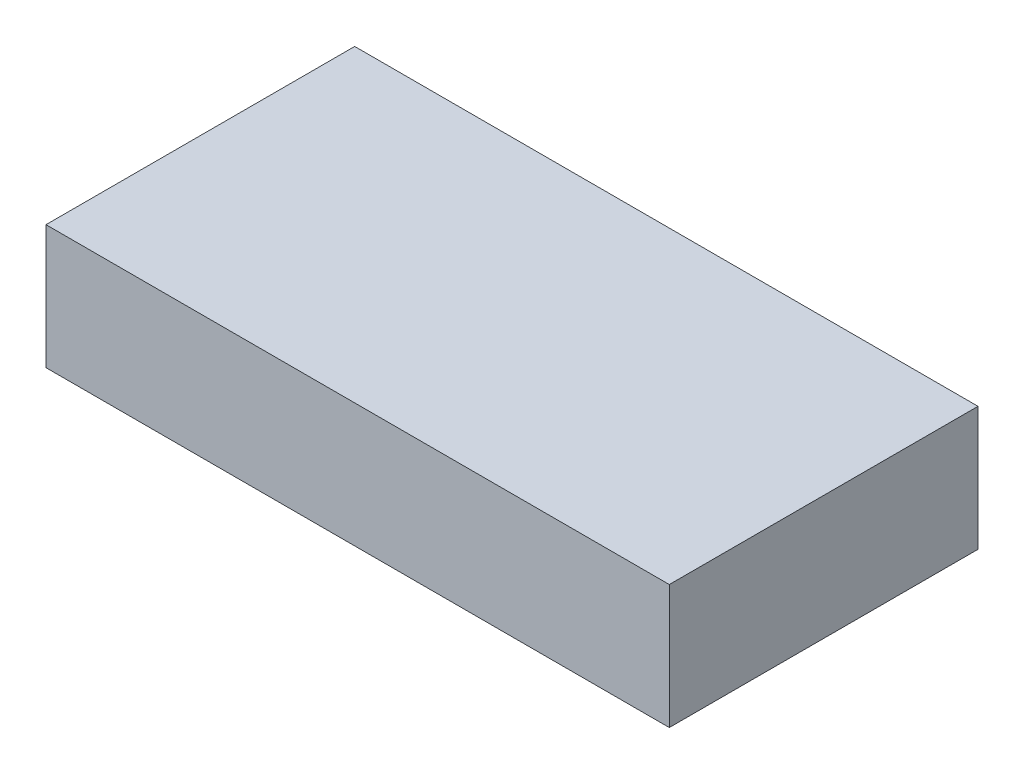
ISO-10303-21;
HEADER;
FILE_DESCRIPTION(('STEP AP214'),'2;1');
FILE_NAME('part.step','',(''),(''),'','','');
FILE_SCHEMA(('AUTOMOTIVE_DESIGN { 1 0 10303 214 1 1 1 1 }'));
ENDSEC;
DATA;
#1=APPLICATION_CONTEXT('core data for automotive mechanical design processes');
#2=APPLICATION_PROTOCOL_DEFINITION('international standard','automotive_design',2000,#1);
#3=PRODUCT_CONTEXT('',#1,'mechanical');
#4=PRODUCT('Part','Part','',(#3));
#5=PRODUCT_RELATED_PRODUCT_CATEGORY('part','',(#4));
#6=PRODUCT_DEFINITION_FORMATION('','',#4);
#7=PRODUCT_DEFINITION_CONTEXT('part definition',#1,'design');
#8=PRODUCT_DEFINITION('design','',#6,#7);
#9=PRODUCT_DEFINITION_SHAPE('','',#8);
#10=(LENGTH_UNIT() NAMED_UNIT(*) SI_UNIT(.MILLI.,.METRE.));
#11=(NAMED_UNIT(*) PLANE_ANGLE_UNIT() SI_UNIT($,.RADIAN.));
#12=(NAMED_UNIT(*) SI_UNIT($,.STERADIAN.) SOLID_ANGLE_UNIT());
#13=UNCERTAINTY_MEASURE_WITH_UNIT(LENGTH_MEASURE(1.E-05),#10,'distance_accuracy_value','');
#14=(GEOMETRIC_REPRESENTATION_CONTEXT(3) GLOBAL_UNCERTAINTY_ASSIGNED_CONTEXT((#13)) GLOBAL_UNIT_ASSIGNED_CONTEXT((#10,
#11,#12)) REPRESENTATION_CONTEXT('',''));
#15=CARTESIAN_POINT('',(0.,0.,0.));
#16=DIRECTION('',(0.,0.,1.));
#17=DIRECTION('',(1.,0.,0.));
#18=AXIS2_PLACEMENT_3D('',#15,#16,#17);
#19=CARTESIAN_POINT('',(7.925,-3.15,-3.925));
#20=DIRECTION('',(1.,0.,0.));
#21=DIRECTION('',(0.,0.,-1.));
#22=AXIS2_PLACEMENT_3D('',#19,#20,#21);
#23=PLANE('',#22);
#24=DIRECTION('',(0.,0.,-1.));
#25=VECTOR('',#24,1.);
#26=CARTESIAN_POINT('',(7.925,0.,-3.925));
#27=LINE('',#26,#25);
#28=CARTESIAN_POINT('',(7.925,0.,3.925));
#29=VERTEX_POINT('',#28);
#30=CARTESIAN_POINT('',(7.925,0.,-3.925));
#31=VERTEX_POINT('',#30);
#32=EDGE_CURVE('E115',#29,#31,#27,.T.);
#33=ORIENTED_EDGE('',*,*,#32,.F.);
#34=DIRECTION('',(0.,1.,0.));
#35=VECTOR('',#34,1.);
#36=CARTESIAN_POINT('',(7.925,-3.15,3.925));
#37=LINE('',#36,#35);
#38=CARTESIAN_POINT('',(7.925,-3.15,3.925));
#39=VERTEX_POINT('',#38);
#40=EDGE_CURVE('E11',#39,#29,#37,.T.);
#41=ORIENTED_EDGE('',*,*,#40,.F.);
#42=DIRECTION('',(0.,0.,-1.));
#43=VECTOR('',#42,1.);
#44=CARTESIAN_POINT('',(7.925,-3.15,-3.925));
#45=LINE('',#44,#43);
#46=CARTESIAN_POINT('',(7.925,-3.15,-3.925));
#47=VERTEX_POINT('',#46);
#48=EDGE_CURVE('E146',#39,#47,#45,.T.);
#49=ORIENTED_EDGE('',*,*,#48,.T.);
#50=DIRECTION('',(0.,1.,0.));
#51=VECTOR('',#50,1.);
#52=CARTESIAN_POINT('',(7.925,-3.15,-3.925));
#53=LINE('',#52,#51);
#54=EDGE_CURVE('E36',#47,#31,#53,.T.);
#55=ORIENTED_EDGE('',*,*,#54,.T.);
#56=EDGE_LOOP('',(#33,#41,#49,#55));
#57=FACE_BOUND('',#56,.T.);
#58=ADVANCED_FACE('F33',(#57),#23,.T.);
#59=CARTESIAN_POINT('',(-7.925,-3.15,3.925));
#60=DIRECTION('',(0.,0.,1.));
#61=DIRECTION('',(1.,0.,0.));
#62=AXIS2_PLACEMENT_3D('',#59,#60,#61);
#63=PLANE('',#62);
#64=DIRECTION('',(1.,0.,0.));
#65=VECTOR('',#64,1.);
#66=CARTESIAN_POINT('',(-7.925,0.,3.925));
#67=LINE('',#66,#65);
#68=CARTESIAN_POINT('',(-7.925,0.,3.925));
#69=VERTEX_POINT('',#68);
#70=EDGE_CURVE('E149',#69,#29,#67,.T.);
#71=ORIENTED_EDGE('',*,*,#70,.F.);
#72=DIRECTION('',(0.,1.,0.));
#73=VECTOR('',#72,1.);
#74=CARTESIAN_POINT('',(-7.925,-3.15,3.925));
#75=LINE('',#74,#73);
#76=CARTESIAN_POINT('',(-7.925,-3.15,3.925));
#77=VERTEX_POINT('',#76);
#78=EDGE_CURVE('E41',#77,#69,#75,.T.);
#79=ORIENTED_EDGE('',*,*,#78,.F.);
#80=DIRECTION('',(1.,0.,0.));
#81=VECTOR('',#80,1.);
#82=CARTESIAN_POINT('',(-7.925,-3.15,3.925));
#83=LINE('',#82,#81);
#84=EDGE_CURVE('E154',#77,#39,#83,.T.);
#85=ORIENTED_EDGE('',*,*,#84,.T.);
#86=ORIENTED_EDGE('',*,*,#40,.T.);
#87=EDGE_LOOP('',(#71,#79,#85,#86));
#88=FACE_BOUND('',#87,.T.);
#89=ADVANCED_FACE('F171',(#88),#63,.T.);
#90=CARTESIAN_POINT('',(-7.925,-3.15,-3.925));
#91=DIRECTION('',(-1.,0.,0.));
#92=DIRECTION('',(0.,0.,1.));
#93=AXIS2_PLACEMENT_3D('',#90,#91,#92);
#94=PLANE('',#93);
#95=DIRECTION('',(0.,0.,1.));
#96=VECTOR('',#95,1.);
#97=CARTESIAN_POINT('',(-7.925,0.,-3.925));
#98=LINE('',#97,#96);
#99=CARTESIAN_POINT('',(-7.925,0.,-3.925));
#100=VERTEX_POINT('',#99);
#101=EDGE_CURVE('E161',#100,#69,#98,.T.);
#102=ORIENTED_EDGE('',*,*,#101,.F.);
#103=DIRECTION('',(0.,1.,0.));
#104=VECTOR('',#103,1.);
#105=CARTESIAN_POINT('',(-7.925,-3.15,-3.925));
#106=LINE('',#105,#104);
#107=CARTESIAN_POINT('',(-7.925,-3.15,-3.925));
#108=VERTEX_POINT('',#107);
#109=EDGE_CURVE('E166',#108,#100,#106,.T.);
#110=ORIENTED_EDGE('',*,*,#109,.F.);
#111=DIRECTION('',(0.,0.,1.));
#112=VECTOR('',#111,1.);
#113=CARTESIAN_POINT('',(-7.925,-3.15,-3.925));
#114=LINE('',#113,#112);
#115=EDGE_CURVE('E151',#108,#77,#114,.T.);
#116=ORIENTED_EDGE('',*,*,#115,.T.);
#117=ORIENTED_EDGE('',*,*,#78,.T.);
#118=EDGE_LOOP('',(#102,#110,#116,#117));
#119=FACE_BOUND('',#118,.T.);
#120=ADVANCED_FACE('F175',(#119),#94,.T.);
#121=CARTESIAN_POINT('',(-7.925,-3.15,-3.925));
#122=DIRECTION('',(0.,0.,-1.));
#123=DIRECTION('',(-1.,0.,0.));
#124=AXIS2_PLACEMENT_3D('',#121,#122,#123);
#125=PLANE('',#124);
#126=DIRECTION('',(-1.,0.,0.));
#127=VECTOR('',#126,1.);
#128=CARTESIAN_POINT('',(-7.925,0.,-3.925));
#129=LINE('',#128,#127);
#130=EDGE_CURVE('E158',#31,#100,#129,.T.);
#131=ORIENTED_EDGE('',*,*,#130,.F.);
#132=ORIENTED_EDGE('',*,*,#54,.F.);
#133=DIRECTION('',(-1.,0.,0.));
#134=VECTOR('',#133,1.);
#135=CARTESIAN_POINT('',(-7.925,-3.15,-3.925));
#136=LINE('',#135,#134);
#137=EDGE_CURVE('E148',#47,#108,#136,.T.);
#138=ORIENTED_EDGE('',*,*,#137,.T.);
#139=ORIENTED_EDGE('',*,*,#109,.T.);
#140=EDGE_LOOP('',(#131,#132,#138,#139));
#141=FACE_BOUND('',#140,.T.);
#142=ADVANCED_FACE('F168',(#141),#125,.T.);
#143=CARTESIAN_POINT('',(0.,-3.15,0.));
#144=DIRECTION('',(0.,1.,0.));
#145=DIRECTION('',(0.,0.,1.));
#146=AXIS2_PLACEMENT_3D('',#143,#144,#145);
#147=PLANE('',#146);
#148=DIRECTION('',(1.,0.,0.));
#149=VECTOR('',#148,1.);
#150=CARTESIAN_POINT('',(0.,-3.15,2.425));
#151=LINE('',#150,#149);
#152=CARTESIAN_POINT('',(-6.425,-3.15,2.425));
#153=VERTEX_POINT('',#152);
#154=CARTESIAN_POINT('',(6.425,-3.15,2.425));
#155=VERTEX_POINT('',#154);
#156=EDGE_CURVE('E141',#153,#155,#151,.T.);
#157=ORIENTED_EDGE('',*,*,#156,.T.);
#158=DIRECTION('',(0.,0.,-1.));
#159=VECTOR('',#158,1.);
#160=CARTESIAN_POINT('',(6.425,-3.15,0.));
#161=LINE('',#160,#159);
#162=CARTESIAN_POINT('',(6.425,-3.15,-2.425));
#163=VERTEX_POINT('',#162);
#164=EDGE_CURVE('E110',#155,#163,#161,.T.);
#165=ORIENTED_EDGE('',*,*,#164,.T.);
#166=DIRECTION('',(-1.,0.,0.));
#167=VECTOR('',#166,1.);
#168=CARTESIAN_POINT('',(0.,-3.15,-2.425));
#169=LINE('',#168,#167);
#170=CARTESIAN_POINT('',(-6.425,-3.15,-2.425));
#171=VERTEX_POINT('',#170);
#172=EDGE_CURVE('E131',#163,#171,#169,.T.);
#173=ORIENTED_EDGE('',*,*,#172,.T.);
#174=DIRECTION('',(0.,0.,1.));
#175=VECTOR('',#174,1.);
#176=CARTESIAN_POINT('',(-6.425,-3.15,0.));
#177=LINE('',#176,#175);
#178=EDGE_CURVE('E49',#171,#153,#177,.T.);
#179=ORIENTED_EDGE('',*,*,#178,.T.);
#180=EDGE_LOOP('',(#157,#165,#173,#179));
#181=FACE_BOUND('',#180,.T.);
#182=ORIENTED_EDGE('',*,*,#48,.F.);
#183=ORIENTED_EDGE('',*,*,#84,.F.);
#184=ORIENTED_EDGE('',*,*,#115,.F.);
#185=ORIENTED_EDGE('',*,*,#137,.F.);
#186=EDGE_LOOP('',(#182,#183,#184,#185));
#187=FACE_BOUND('',#186,.T.);
#188=ADVANCED_FACE('F177',(#181,#187),#147,.F.);
#189=CARTESIAN_POINT('',(0.,0.,0.));
#190=DIRECTION('',(0.,1.,0.));
#191=DIRECTION('',(0.,0.,1.));
#192=AXIS2_PLACEMENT_3D('',#189,#190,#191);
#193=PLANE('',#192);
#194=ORIENTED_EDGE('',*,*,#32,.T.);
#195=ORIENTED_EDGE('',*,*,#130,.T.);
#196=ORIENTED_EDGE('',*,*,#101,.T.);
#197=ORIENTED_EDGE('',*,*,#70,.T.);
#198=EDGE_LOOP('',(#194,#195,#196,#197));
#199=FACE_BOUND('',#198,.T.);
#200=ADVANCED_FACE('F170',(#199),#193,.T.);
#201=CARTESIAN_POINT('',(6.425,-3.15,-3.925));
#202=DIRECTION('',(1.,0.,0.));
#203=DIRECTION('',(0.,0.,-1.));
#204=AXIS2_PLACEMENT_3D('',#201,#202,#203);
#205=PLANE('',#204);
#206=DIRECTION('',(0.,0.,-1.));
#207=VECTOR('',#206,1.);
#208=CARTESIAN_POINT('',(6.425,-1.5,0.));
#209=LINE('',#208,#207);
#210=CARTESIAN_POINT('',(6.425,-1.5,2.425));
#211=VERTEX_POINT('',#210);
#212=CARTESIAN_POINT('',(6.425,-1.5,-2.425));
#213=VERTEX_POINT('',#212);
#214=EDGE_CURVE('E108',#211,#213,#209,.T.);
#215=ORIENTED_EDGE('',*,*,#214,.T.);
#216=DIRECTION('',(0.,1.,0.));
#217=VECTOR('',#216,1.);
#218=CARTESIAN_POINT('',(6.425,-3.15,-2.425));
#219=LINE('',#218,#217);
#220=EDGE_CURVE('E136',#163,#213,#219,.T.);
#221=ORIENTED_EDGE('',*,*,#220,.F.);
#222=ORIENTED_EDGE('',*,*,#164,.F.);
#223=DIRECTION('',(0.,1.,0.));
#224=VECTOR('',#223,1.);
#225=CARTESIAN_POINT('',(6.425,-3.15,2.425));
#226=LINE('',#225,#224);
#227=EDGE_CURVE('E105',#155,#211,#226,.T.);
#228=ORIENTED_EDGE('',*,*,#227,.T.);
#229=EDGE_LOOP('',(#215,#221,#222,#228));
#230=FACE_BOUND('',#229,.T.);
#231=ADVANCED_FACE('F107',(#230),#205,.F.);
#232=CARTESIAN_POINT('',(-7.925,-3.15,2.425));
#233=DIRECTION('',(0.,0.,1.));
#234=DIRECTION('',(1.,0.,0.));
#235=AXIS2_PLACEMENT_3D('',#232,#233,#234);
#236=PLANE('',#235);
#237=DIRECTION('',(1.,0.,0.));
#238=VECTOR('',#237,1.);
#239=CARTESIAN_POINT('',(0.,-1.5,2.425));
#240=LINE('',#239,#238);
#241=CARTESIAN_POINT('',(-6.425,-1.5,2.425));
#242=VERTEX_POINT('',#241);
#243=EDGE_CURVE('E123',#242,#211,#240,.T.);
#244=ORIENTED_EDGE('',*,*,#243,.T.);
#245=ORIENTED_EDGE('',*,*,#227,.F.);
#246=ORIENTED_EDGE('',*,*,#156,.F.);
#247=DIRECTION('',(0.,1.,0.));
#248=VECTOR('',#247,1.);
#249=CARTESIAN_POINT('',(-6.425,-3.15,2.425));
#250=LINE('',#249,#248);
#251=EDGE_CURVE('E116',#153,#242,#250,.T.);
#252=ORIENTED_EDGE('',*,*,#251,.T.);
#253=EDGE_LOOP('',(#244,#245,#246,#252));
#254=FACE_BOUND('',#253,.T.);
#255=ADVANCED_FACE('F127',(#254),#236,.F.);
#256=CARTESIAN_POINT('',(-6.425,-3.15,-3.925));
#257=DIRECTION('',(-1.,0.,0.));
#258=DIRECTION('',(0.,0.,1.));
#259=AXIS2_PLACEMENT_3D('',#256,#257,#258);
#260=PLANE('',#259);
#261=DIRECTION('',(0.,0.,1.));
#262=VECTOR('',#261,1.);
#263=CARTESIAN_POINT('',(-6.425,-1.5,0.));
#264=LINE('',#263,#262);
#265=CARTESIAN_POINT('',(-6.425,-1.5,-2.425));
#266=VERTEX_POINT('',#265);
#267=EDGE_CURVE('E129',#266,#242,#264,.T.);
#268=ORIENTED_EDGE('',*,*,#267,.T.);
#269=ORIENTED_EDGE('',*,*,#251,.F.);
#270=ORIENTED_EDGE('',*,*,#178,.F.);
#271=DIRECTION('',(0.,1.,0.));
#272=VECTOR('',#271,1.);
#273=CARTESIAN_POINT('',(-6.425,-3.15,-2.425));
#274=LINE('',#273,#272);
#275=EDGE_CURVE('E137',#171,#266,#274,.T.);
#276=ORIENTED_EDGE('',*,*,#275,.T.);
#277=EDGE_LOOP('',(#268,#269,#270,#276));
#278=FACE_BOUND('',#277,.T.);
#279=ADVANCED_FACE('F229',(#278),#260,.F.);
#280=CARTESIAN_POINT('',(-7.925,-3.15,-2.425));
#281=DIRECTION('',(0.,0.,-1.));
#282=DIRECTION('',(-1.,0.,0.));
#283=AXIS2_PLACEMENT_3D('',#280,#281,#282);
#284=PLANE('',#283);
#285=DIRECTION('',(-1.,0.,0.));
#286=VECTOR('',#285,1.);
#287=CARTESIAN_POINT('',(0.,-1.5,-2.425));
#288=LINE('',#287,#286);
#289=EDGE_CURVE('E125',#213,#266,#288,.T.);
#290=ORIENTED_EDGE('',*,*,#289,.T.);
#291=ORIENTED_EDGE('',*,*,#275,.F.);
#292=ORIENTED_EDGE('',*,*,#172,.F.);
#293=ORIENTED_EDGE('',*,*,#220,.T.);
#294=EDGE_LOOP('',(#290,#291,#292,#293));
#295=FACE_BOUND('',#294,.T.);
#296=ADVANCED_FACE('F238',(#295),#284,.F.);
#297=CARTESIAN_POINT('',(0.,-1.5,0.));
#298=DIRECTION('',(0.,1.,0.));
#299=DIRECTION('',(0.,0.,1.));
#300=AXIS2_PLACEMENT_3D('',#297,#298,#299);
#301=PLANE('',#300);
#302=ORIENTED_EDGE('',*,*,#214,.F.);
#303=ORIENTED_EDGE('',*,*,#243,.F.);
#304=ORIENTED_EDGE('',*,*,#267,.F.);
#305=ORIENTED_EDGE('',*,*,#289,.F.);
#306=EDGE_LOOP('',(#302,#303,#304,#305));
#307=FACE_BOUND('',#306,.T.);
#308=ADVANCED_FACE('F121',(#307),#301,.F.);
#309=CLOSED_SHELL('',(#58,#89,#120,#142,#188,#200,#231,#255,#279,#296,#308));
#310=MANIFOLD_SOLID_BREP('B2',#309);
#311=ADVANCED_BREP_SHAPE_REPRESENTATION('',(#18,#310),#14);
#312=SHAPE_DEFINITION_REPRESENTATION(#9,#311);
ENDSEC;
END-ISO-10303-21;
